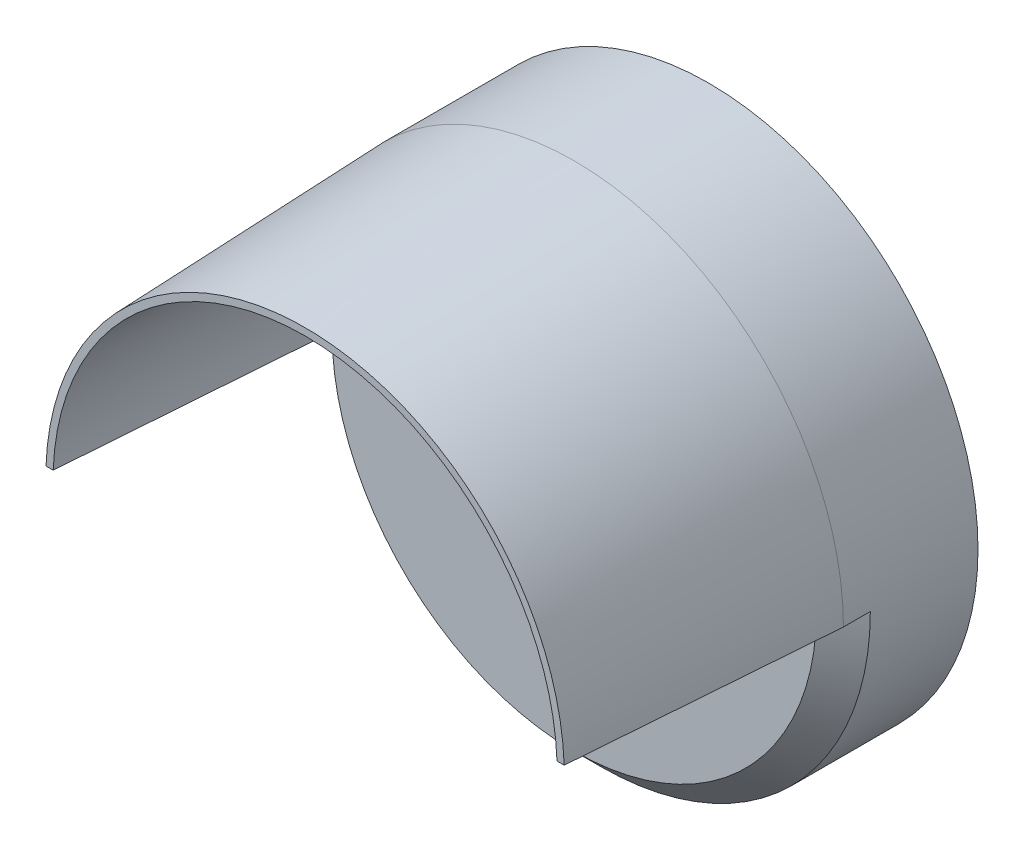
ISO-10303-21;
HEADER;
FILE_DESCRIPTION(('STEP AP214'),'2;1');
FILE_NAME('part.step','',(''),(''),'','','');
FILE_SCHEMA(('AUTOMOTIVE_DESIGN { 1 0 10303 214 1 1 1 1 }'));
ENDSEC;
DATA;
#1=APPLICATION_CONTEXT('core data for automotive mechanical design processes');
#2=APPLICATION_PROTOCOL_DEFINITION('international standard','automotive_design',2000,#1);
#3=PRODUCT_CONTEXT('',#1,'mechanical');
#4=PRODUCT('Part','Part','',(#3));
#5=PRODUCT_RELATED_PRODUCT_CATEGORY('part','',(#4));
#6=PRODUCT_DEFINITION_FORMATION('','',#4);
#7=PRODUCT_DEFINITION_CONTEXT('part definition',#1,'design');
#8=PRODUCT_DEFINITION('design','',#6,#7);
#9=PRODUCT_DEFINITION_SHAPE('','',#8);
#10=(LENGTH_UNIT() NAMED_UNIT(*) SI_UNIT(.MILLI.,.METRE.));
#11=(NAMED_UNIT(*) PLANE_ANGLE_UNIT() SI_UNIT($,.RADIAN.));
#12=(NAMED_UNIT(*) SI_UNIT($,.STERADIAN.) SOLID_ANGLE_UNIT());
#13=UNCERTAINTY_MEASURE_WITH_UNIT(LENGTH_MEASURE(1.E-05),#10,'distance_accuracy_value','');
#14=(GEOMETRIC_REPRESENTATION_CONTEXT(3) GLOBAL_UNCERTAINTY_ASSIGNED_CONTEXT((#13)) GLOBAL_UNIT_ASSIGNED_CONTEXT((#10,
#11,#12)) REPRESENTATION_CONTEXT('',''));
#15=CARTESIAN_POINT('',(0.,0.,0.));
#16=DIRECTION('',(0.,0.,1.));
#17=DIRECTION('',(1.,0.,0.));
#18=AXIS2_PLACEMENT_3D('',#15,#16,#17);
#19=CARTESIAN_POINT('',(0.,0.,12.7));
#20=DIRECTION('',(0.,0.,-1.));
#21=DIRECTION('',(-1.,0.,0.));
#22=AXIS2_PLACEMENT_3D('',#19,#20,#21);
#23=CONICAL_SURFACE('',#22,22.86,0.785398163397446);
#24=CARTESIAN_POINT('',(0.,0.,10.16));
#25=DIRECTION('',(0.,0.,1.));
#26=DIRECTION('',(1.,0.,0.));
#27=AXIS2_PLACEMENT_3D('',#24,#25,#26);
#28=CIRCLE('',#27,25.4);
#29=CARTESIAN_POINT('',(25.4,0.,10.16));
#30=VERTEX_POINT('',#29);
#31=CARTESIAN_POINT('',(-25.4,0.,10.16));
#32=VERTEX_POINT('',#31);
#33=EDGE_CURVE('E109',#30,#32,#28,.F.);
#34=ORIENTED_EDGE('',*,*,#33,.F.);
#35=DIRECTION('',(0.707106781186546,0.,-0.707106781186549));
#36=VECTOR('',#35,1.);
#37=CARTESIAN_POINT('',(0.,0.,35.5600000000001));
#38=LINE('',#37,#36);
#39=CARTESIAN_POINT('',(22.86,0.,12.7));
#40=VERTEX_POINT('',#39);
#41=EDGE_CURVE('E11',#30,#40,#38,.F.);
#42=ORIENTED_EDGE('',*,*,#41,.T.);
#43=CARTESIAN_POINT('',(0.,0.,12.7));
#44=DIRECTION('',(0.,0.,1.));
#45=DIRECTION('',(1.,0.,0.));
#46=AXIS2_PLACEMENT_3D('',#43,#44,#45);
#47=CIRCLE('',#46,22.86);
#48=CARTESIAN_POINT('',(-22.86,0.,12.7));
#49=VERTEX_POINT('',#48);
#50=EDGE_CURVE('E129',#49,#40,#47,.T.);
#51=ORIENTED_EDGE('',*,*,#50,.F.);
#52=DIRECTION('',(0.707106781186546,0.,0.707106781186549));
#53=VECTOR('',#52,1.);
#54=CARTESIAN_POINT('',(0.,0.,35.5600000000001));
#55=LINE('',#54,#53);
#56=EDGE_CURVE('E43',#49,#32,#55,.F.);
#57=ORIENTED_EDGE('',*,*,#56,.T.);
#58=EDGE_LOOP('',(#34,#42,#51,#57));
#59=FACE_BOUND('',#58,.T.);
#60=ADVANCED_FACE('F35',(#59),#23,.T.);
#61=CARTESIAN_POINT('',(0.,0.,12.7));
#62=DIRECTION('',(0.,0.,1.));
#63=DIRECTION('',(1.,0.,0.));
#64=AXIS2_PLACEMENT_3D('',#61,#62,#63);
#65=PLANE('',#64);
#66=CARTESIAN_POINT('',(0.,0.,12.7));
#67=DIRECTION('',(0.,0.,1.));
#68=DIRECTION('',(1.,0.,0.));
#69=AXIS2_PLACEMENT_3D('',#66,#67,#68);
#70=CIRCLE('',#69,10.795);
#71=CARTESIAN_POINT('',(10.795,0.,12.7));
#72=VERTEX_POINT('',#71);
#73=EDGE_CURVE('E135',#72,#72,#70,.F.);
#74=ORIENTED_EDGE('',*,*,#73,.T.);
#75=EDGE_LOOP('',(#74));
#76=FACE_BOUND('',#75,.T.);
#77=EDGE_CURVE('E68',#40,#49,#47,.T.);
#78=ORIENTED_EDGE('',*,*,#77,.T.);
#79=ORIENTED_EDGE('',*,*,#50,.T.);
#80=EDGE_LOOP('',(#78,#79));
#81=FACE_BOUND('',#80,.T.);
#82=ADVANCED_FACE('F140',(#76,#81),#65,.T.);
#83=CARTESIAN_POINT('',(0.,0.,0.));
#84=DIRECTION('',(0.,0.,1.));
#85=DIRECTION('',(1.,0.,0.));
#86=AXIS2_PLACEMENT_3D('',#83,#84,#85);
#87=PLANE('',#86);
#88=CARTESIAN_POINT('',(0.,0.,0.));
#89=DIRECTION('',(0.,0.,1.));
#90=DIRECTION('',(1.,0.,0.));
#91=AXIS2_PLACEMENT_3D('',#88,#89,#90);
#92=CIRCLE('',#91,25.4);
#93=CARTESIAN_POINT('',(25.4,0.,0.));
#94=VERTEX_POINT('',#93);
#95=EDGE_CURVE('E126',#94,#94,#92,.T.);
#96=ORIENTED_EDGE('',*,*,#95,.F.);
#97=EDGE_LOOP('',(#96));
#98=FACE_BOUND('',#97,.T.);
#99=CARTESIAN_POINT('',(0.,0.,0.));
#100=DIRECTION('',(0.,0.,1.));
#101=DIRECTION('',(1.,0.,0.));
#102=AXIS2_PLACEMENT_3D('',#99,#100,#101);
#103=CIRCLE('',#102,9.525);
#104=CARTESIAN_POINT('',(9.525,0.,0.));
#105=VERTEX_POINT('',#104);
#106=EDGE_CURVE('E122',#105,#105,#103,.T.);
#107=ORIENTED_EDGE('',*,*,#106,.T.);
#108=EDGE_LOOP('',(#107));
#109=FACE_BOUND('',#108,.T.);
#110=ADVANCED_FACE('F142',(#98,#109),#87,.F.);
#111=CARTESIAN_POINT('',(0.,0.,12.7));
#112=DIRECTION('',(0.,0.,-1.));
#113=DIRECTION('',(-1.,0.,0.));
#114=AXIS2_PLACEMENT_3D('',#111,#112,#113);
#115=CYLINDRICAL_SURFACE('',#114,25.4);
#116=ORIENTED_EDGE('',*,*,#33,.T.);
#117=DIRECTION('',(0.,0.,1.));
#118=VECTOR('',#117,1.);
#119=CARTESIAN_POINT('',(-25.4,0.,10.16));
#120=LINE('',#119,#118);
#121=CARTESIAN_POINT('',(-25.4,0.,12.7));
#122=VERTEX_POINT('',#121);
#123=EDGE_CURVE('E105',#32,#122,#120,.T.);
#124=ORIENTED_EDGE('',*,*,#123,.T.);
#125=CARTESIAN_POINT('',(0.,0.,12.7));
#126=DIRECTION('',(0.,0.,1.));
#127=DIRECTION('',(1.,0.,0.));
#128=AXIS2_PLACEMENT_3D('',#125,#126,#127);
#129=CIRCLE('',#128,25.4);
#130=CARTESIAN_POINT('',(25.4,0.,12.7));
#131=VERTEX_POINT('',#130);
#132=EDGE_CURVE('E96',#131,#122,#129,.T.);
#133=ORIENTED_EDGE('',*,*,#132,.F.);
#134=DIRECTION('',(0.,0.,1.));
#135=VECTOR('',#134,1.);
#136=CARTESIAN_POINT('',(25.4,0.,10.16));
#137=LINE('',#136,#135);
#138=EDGE_CURVE('E113',#30,#131,#137,.T.);
#139=ORIENTED_EDGE('',*,*,#138,.F.);
#140=EDGE_LOOP('',(#116,#124,#133,#139));
#141=FACE_BOUND('',#140,.T.);
#142=ORIENTED_EDGE('',*,*,#95,.T.);
#143=EDGE_LOOP('',(#142));
#144=FACE_BOUND('',#143,.T.);
#145=ADVANCED_FACE('F106',(#141,#144),#115,.T.);
#146=CARTESIAN_POINT('',(0.,0.,12.7));
#147=DIRECTION('',(0.,0.,-1.));
#148=DIRECTION('',(-1.,0.,0.));
#149=AXIS2_PLACEMENT_3D('',#146,#147,#148);
#150=CYLINDRICAL_SURFACE('',#149,9.525);
#151=CARTESIAN_POINT('',(0.,0.,11.43));
#152=DIRECTION('',(0.,0.,1.));
#153=DIRECTION('',(1.,0.,0.));
#154=AXIS2_PLACEMENT_3D('',#151,#152,#153);
#155=CIRCLE('',#154,9.525);
#156=CARTESIAN_POINT('',(9.525,0.,11.43));
#157=VERTEX_POINT('',#156);
#158=EDGE_CURVE('E132',#157,#157,#155,.T.);
#159=ORIENTED_EDGE('',*,*,#158,.T.);
#160=EDGE_LOOP('',(#159));
#161=FACE_BOUND('',#160,.T.);
#162=ORIENTED_EDGE('',*,*,#106,.F.);
#163=EDGE_LOOP('',(#162));
#164=FACE_BOUND('',#163,.T.);
#165=ADVANCED_FACE('F152',(#161,#164),#150,.F.);
#166=CARTESIAN_POINT('',(0.,0.,11.43));
#167=DIRECTION('',(0.,0.,1.));
#168=DIRECTION('',(1.,0.,0.));
#169=AXIS2_PLACEMENT_3D('',#166,#167,#168);
#170=TOROIDAL_SURFACE('',#169,10.795,1.27);
#171=ORIENTED_EDGE('',*,*,#73,.F.);
#172=EDGE_LOOP('',(#171));
#173=FACE_BOUND('',#172,.T.);
#174=ORIENTED_EDGE('',*,*,#158,.F.);
#175=EDGE_LOOP('',(#174));
#176=FACE_BOUND('',#175,.T.);
#177=ADVANCED_FACE('F37',(#173,#176),#170,.T.);
#178=CARTESIAN_POINT('',(25.4,0.,10.16));
#179=DIRECTION('',(0.,1.,0.));
#180=DIRECTION('',(0.,0.,1.));
#181=AXIS2_PLACEMENT_3D('',#178,#179,#180);
#182=PLANE('',#181);
#183=ORIENTED_EDGE('',*,*,#41,.F.);
#184=ORIENTED_EDGE('',*,*,#138,.T.);
#185=DIRECTION('',(-1.,0.,0.));
#186=VECTOR('',#185,1.);
#187=CARTESIAN_POINT('',(25.4,0.,12.7));
#188=LINE('',#187,#186);
#189=EDGE_CURVE('E114',#131,#40,#188,.T.);
#190=ORIENTED_EDGE('',*,*,#189,.T.);
#191=EDGE_LOOP('',(#183,#184,#190));
#192=FACE_BOUND('',#191,.T.);
#193=ADVANCED_FACE('F166',(#192),#182,.F.);
#194=CARTESIAN_POINT('',(-22.86,0.,10.16));
#195=DIRECTION('',(0.,1.,0.));
#196=DIRECTION('',(-1.,0.,0.));
#197=AXIS2_PLACEMENT_3D('',#194,#195,#196);
#198=PLANE('',#197);
#199=ORIENTED_EDGE('',*,*,#56,.F.);
#200=DIRECTION('',(-1.,0.,0.));
#201=VECTOR('',#200,1.);
#202=CARTESIAN_POINT('',(-22.86,0.,12.7));
#203=LINE('',#202,#201);
#204=EDGE_CURVE('E50',#49,#122,#203,.T.);
#205=ORIENTED_EDGE('',*,*,#204,.T.);
#206=ORIENTED_EDGE('',*,*,#123,.F.);
#207=EDGE_LOOP('',(#199,#205,#206));
#208=FACE_BOUND('',#207,.T.);
#209=ADVANCED_FACE('F116',(#208),#198,.F.);
#210=CARTESIAN_POINT('',(0.,0.,12.7));
#211=DIRECTION('',(0.,0.,-1.));
#212=DIRECTION('',(1.,0.,0.));
#213=AXIS2_PLACEMENT_3D('',#210,#211,#212);
#214=CONICAL_SURFACE('',#213,25.4,0.0366519142918809);
#215=ORIENTED_EDGE('',*,*,#132,.T.);
#216=CARTESIAN_POINT('',(-24.4508918749647,0.931375718873736,38.1));
#217=CARTESIAN_POINT('',(-24.5315169075468,0.853763181321809,35.9833907585621));
#218=CARTESIAN_POINT('',(-24.6117441010983,0.776150089147404,33.8667663917451));
#219=CARTESIAN_POINT('',(-24.7714249930016,0.620922846123738,29.6334887864744));
#220=CARTESIAN_POINT('',(-24.8508786914508,0.543308695274611,27.5168355480243));
#221=CARTESIAN_POINT('',(-25.0090347958034,0.388079366417528,23.2835010589765));
#222=CARTESIAN_POINT('',(-25.0877372017117,0.310464188409579,21.1668198083789));
#223=CARTESIAN_POINT('',(-25.244411398225,0.155232832396481,16.9334300357739));
#224=CARTESIAN_POINT('',(-25.322383188738,0.0776166543912076,14.8167215137631));
#225=CARTESIAN_POINT('',(-25.4,0.,12.7));
#226=B_SPLINE_CURVE_WITH_KNOTS('',3,(#216,#217,#218,#219,#220,#221,#222,#223,#224,#225),
.UNSPECIFIED.,.F.,.F.,(4,2,2,2,4),(0.,6.35869706874923,12.7173933362861,19.0760895624738,
25.434786589861),.UNSPECIFIED.);
#227=CARTESIAN_POINT('',(-24.4508918749647,0.931375718873736,38.1));
#228=VERTEX_POINT('',#227);
#229=EDGE_CURVE('E90',#228,#122,#226,.T.);
#230=ORIENTED_EDGE('',*,*,#229,.F.);
#231=CARTESIAN_POINT('',(0.,0.,38.1));
#232=DIRECTION('',(0.,0.,1.));
#233=DIRECTION('',(1.,0.,0.));
#234=AXIS2_PLACEMENT_3D('',#231,#232,#233);
#235=CIRCLE('',#234,24.4686242811263);
#236=CARTESIAN_POINT('',(24.4508918749647,0.931375718873733,38.1));
#237=VERTEX_POINT('',#236);
#238=EDGE_CURVE('E203',#237,#228,#235,.T.);
#239=ORIENTED_EDGE('',*,*,#238,.F.);
#240=CARTESIAN_POINT('',(24.4508918749647,0.931375718873733,38.1));
#241=CARTESIAN_POINT('',(24.5315169075468,0.853763181321806,35.9833907585621));
#242=CARTESIAN_POINT('',(24.6117441010983,0.776150089147401,33.8667663917451));
#243=CARTESIAN_POINT('',(24.7714249930016,0.620922846123735,29.6334887864744));
#244=CARTESIAN_POINT('',(24.8508786914508,0.543308695274608,27.5168355480243));
#245=CARTESIAN_POINT('',(25.0090347958034,0.388079366417525,23.2835010589765));
#246=CARTESIAN_POINT('',(25.0877372017117,0.310464188409576,21.1668198083789));
#247=CARTESIAN_POINT('',(25.244411398225,0.155232832396478,16.9334300357739));
#248=CARTESIAN_POINT('',(25.322383188738,0.0776166543912046,14.8167215137631));
#249=CARTESIAN_POINT('',(25.4,0.,12.7));
#250=B_SPLINE_CURVE_WITH_KNOTS('',3,(#240,#241,#242,#243,#244,#245,#246,#247,#248,#249),
.UNSPECIFIED.,.F.,.F.,(4,2,2,2,4),(0.,6.35869706874923,12.7173933362861,19.0760895624738,
25.434786589861),.UNSPECIFIED.);
#251=EDGE_CURVE('E76',#237,#131,#250,.T.);
#252=ORIENTED_EDGE('',*,*,#251,.T.);
#253=EDGE_LOOP('',(#215,#230,#239,#252));
#254=FACE_BOUND('',#253,.T.);
#255=ADVANCED_FACE('F101',(#254),#214,.T.);
#256=CARTESIAN_POINT('',(-22.86,0.,12.7));
#257=DIRECTION('',(0.,-0.999328393778656,0.0366437087065563));
#258=DIRECTION('',(0.,-0.0366437087065563,-0.999328393778656));
#259=AXIS2_PLACEMENT_3D('',#256,#257,#258);
#260=PLANE('',#259);
#261=ORIENTED_EDGE('',*,*,#204,.F.);
#262=CARTESIAN_POINT('',(-23.7731381577382,0.931375718873736,38.1));
#263=CARTESIAN_POINT('',(-23.6985027278943,0.853759162051998,35.9832811471012));
#264=CARTESIAN_POINT('',(-23.6235165861846,0.776143057796505,33.8665746363566));
#265=CARTESIAN_POINT('',(-23.4728218729108,0.620911800620678,29.6331875591908));
#266=CARTESIAN_POINT('',(-23.3971133014359,0.543296647700227,27.5165069927666));
#267=CARTESIAN_POINT('',(-23.2449527035873,0.388067319719146,23.2831725276086));
#268=CARTESIAN_POINT('',(-23.1685006772087,0.310453144658522,21.1665186288751));
#269=CARTESIAN_POINT('',(-23.01483054743,0.155225803336664,16.9332383428665));
#270=CARTESIAN_POINT('',(-22.9376124439354,0.0776126370755539,14.816611955595));
#271=CARTESIAN_POINT('',(-22.86,0.,12.7));
#272=B_SPLINE_CURVE_WITH_KNOTS('',3,(#262,#263,#264,#265,#266,#267,#268,#269,#270,#271),
.UNSPECIFIED.,.F.,.F.,(4,2,2,2,4),(0.,6.35836779999243,12.7167348153882,19.0751018736172,
25.4334697164567),.UNSPECIFIED.);
#273=CARTESIAN_POINT('',(-23.7731381577382,0.931375718873736,38.1));
#274=VERTEX_POINT('',#273);
#275=EDGE_CURVE('E97',#274,#49,#272,.T.);
#276=ORIENTED_EDGE('',*,*,#275,.F.);
#277=DIRECTION('',(-1.,0.,0.));
#278=VECTOR('',#277,1.);
#279=CARTESIAN_POINT('',(-22.86,0.931375718873736,38.1));
#280=LINE('',#279,#278);
#281=EDGE_CURVE('E94',#274,#228,#280,.T.);
#282=ORIENTED_EDGE('',*,*,#281,.T.);
#283=ORIENTED_EDGE('',*,*,#229,.T.);
#284=EDGE_LOOP('',(#261,#276,#282,#283));
#285=FACE_BOUND('',#284,.T.);
#286=ADVANCED_FACE('F92',(#285),#260,.T.);
#287=CARTESIAN_POINT('',(0.,0.,12.7));
#288=DIRECTION('',(0.,0.,1.));
#289=DIRECTION('',(1.,0.,0.));
#290=AXIS2_PLACEMENT_3D('',#287,#288,#289);
#291=CONICAL_SURFACE('',#290,22.86,0.0366519142918809);
#292=ORIENTED_EDGE('',*,*,#77,.F.);
#293=CARTESIAN_POINT('',(23.7731381577382,0.931375718873733,38.1));
#294=CARTESIAN_POINT('',(23.6985027278943,0.853759162051995,35.9832811471012));
#295=CARTESIAN_POINT('',(23.6235165861846,0.776143057796502,33.8665746363566));
#296=CARTESIAN_POINT('',(23.4728218729108,0.620911800620675,29.6331875591908));
#297=CARTESIAN_POINT('',(23.3971133014359,0.543296647700224,27.5165069927666));
#298=CARTESIAN_POINT('',(23.2449527035873,0.388067319719143,23.2831725276086));
#299=CARTESIAN_POINT('',(23.1685006772087,0.310453144658519,21.1665186288751));
#300=CARTESIAN_POINT('',(23.01483054743,0.155225803336661,16.9332383428665));
#301=CARTESIAN_POINT('',(22.9376124439354,0.0776126370755511,14.816611955595));
#302=CARTESIAN_POINT('',(22.86,0.,12.7));
#303=B_SPLINE_CURVE_WITH_KNOTS('',3,(#293,#294,#295,#296,#297,#298,#299,#300,#301,#302),
.UNSPECIFIED.,.F.,.F.,(4,2,2,2,4),(0.,6.35836779999243,12.7167348153882,19.0751018736172,
25.4334697164567),.UNSPECIFIED.);
#304=CARTESIAN_POINT('',(23.7731381577382,0.931375718873733,38.1));
#305=VERTEX_POINT('',#304);
#306=EDGE_CURVE('E191',#305,#40,#303,.T.);
#307=ORIENTED_EDGE('',*,*,#306,.F.);
#308=CARTESIAN_POINT('',(0.,0.,38.1));
#309=DIRECTION('',(0.,0.,1.));
#310=DIRECTION('',(1.,0.,0.));
#311=AXIS2_PLACEMENT_3D('',#308,#309,#310);
#312=CIRCLE('',#311,23.7913757188737);
#313=EDGE_CURVE('E220',#305,#274,#312,.T.);
#314=ORIENTED_EDGE('',*,*,#313,.T.);
#315=ORIENTED_EDGE('',*,*,#275,.T.);
#316=EDGE_LOOP('',(#292,#307,#314,#315));
#317=FACE_BOUND('',#316,.T.);
#318=ADVANCED_FACE('F182',(#317),#291,.F.);
#319=CARTESIAN_POINT('',(25.4,0.,12.7));
#320=DIRECTION('',(0.,-0.999328393778656,0.0366437087065563));
#321=DIRECTION('',(0.,-0.0366437087065563,-0.999328393778656));
#322=AXIS2_PLACEMENT_3D('',#319,#320,#321);
#323=PLANE('',#322);
#324=ORIENTED_EDGE('',*,*,#189,.F.);
#325=ORIENTED_EDGE('',*,*,#251,.F.);
#326=DIRECTION('',(-1.,0.,0.));
#327=VECTOR('',#326,1.);
#328=CARTESIAN_POINT('',(25.4,0.931375718873734,38.1));
#329=LINE('',#328,#327);
#330=EDGE_CURVE('E219',#237,#305,#329,.T.);
#331=ORIENTED_EDGE('',*,*,#330,.T.);
#332=ORIENTED_EDGE('',*,*,#306,.T.);
#333=EDGE_LOOP('',(#324,#325,#331,#332));
#334=FACE_BOUND('',#333,.T.);
#335=ADVANCED_FACE('F186',(#334),#323,.T.);
#336=CARTESIAN_POINT('',(0.,0.,38.1));
#337=DIRECTION('',(0.,0.,1.));
#338=DIRECTION('',(1.,0.,0.));
#339=AXIS2_PLACEMENT_3D('',#336,#337,#338);
#340=PLANE('',#339);
#341=ORIENTED_EDGE('',*,*,#238,.T.);
#342=ORIENTED_EDGE('',*,*,#281,.F.);
#343=ORIENTED_EDGE('',*,*,#313,.F.);
#344=ORIENTED_EDGE('',*,*,#330,.F.);
#345=EDGE_LOOP('',(#341,#342,#343,#344));
#346=FACE_BOUND('',#345,.T.);
#347=ADVANCED_FACE('F225',(#346),#340,.T.);
#348=CLOSED_SHELL('',(#60,#82,#110,#145,#165,#177,#193,#209,#255,#286,#318,#335,#347));
#349=MANIFOLD_SOLID_BREP('B2',#348);
#350=ADVANCED_BREP_SHAPE_REPRESENTATION('',(#18,#349),#14);
#351=SHAPE_DEFINITION_REPRESENTATION(#9,#350);
ENDSEC;
END-ISO-10303-21;
